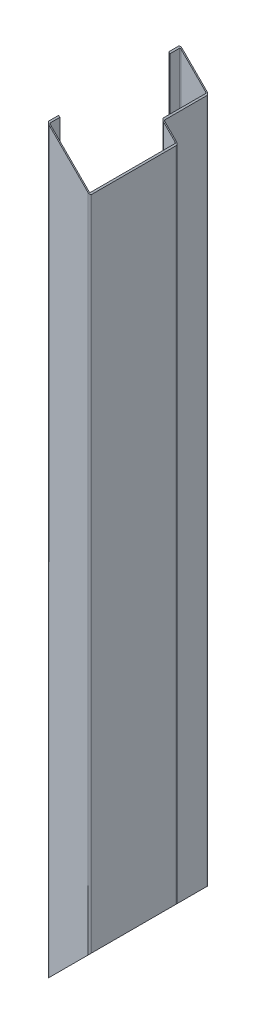
ISO-10303-21;
HEADER;
FILE_DESCRIPTION(('STEP AP214'),'2;1');
FILE_NAME('part.step','',(''),(''),'','','');
FILE_SCHEMA(('AUTOMOTIVE_DESIGN { 1 0 10303 214 1 1 1 1 }'));
ENDSEC;
DATA;
#1=APPLICATION_CONTEXT('core data for automotive mechanical design processes');
#2=APPLICATION_PROTOCOL_DEFINITION('international standard','automotive_design',2000,#1);
#3=PRODUCT_CONTEXT('',#1,'mechanical');
#4=PRODUCT('Part','Part','',(#3));
#5=PRODUCT_RELATED_PRODUCT_CATEGORY('part','',(#4));
#6=PRODUCT_DEFINITION_FORMATION('','',#4);
#7=PRODUCT_DEFINITION_CONTEXT('part definition',#1,'design');
#8=PRODUCT_DEFINITION('design','',#6,#7);
#9=PRODUCT_DEFINITION_SHAPE('','',#8);
#10=(LENGTH_UNIT() NAMED_UNIT(*) SI_UNIT(.MILLI.,.METRE.));
#11=(NAMED_UNIT(*) PLANE_ANGLE_UNIT() SI_UNIT($,.RADIAN.));
#12=(NAMED_UNIT(*) SI_UNIT($,.STERADIAN.) SOLID_ANGLE_UNIT());
#13=UNCERTAINTY_MEASURE_WITH_UNIT(LENGTH_MEASURE(1.E-05),#10,'distance_accuracy_value','');
#14=(GEOMETRIC_REPRESENTATION_CONTEXT(3) GLOBAL_UNCERTAINTY_ASSIGNED_CONTEXT((#13)) GLOBAL_UNIT_ASSIGNED_CONTEXT((#10,
#11,#12)) REPRESENTATION_CONTEXT('',''));
#15=CARTESIAN_POINT('',(0.,0.,0.));
#16=DIRECTION('',(0.,0.,1.));
#17=DIRECTION('',(1.,0.,0.));
#18=AXIS2_PLACEMENT_3D('',#15,#16,#17);
#19=CARTESIAN_POINT('',(10.75,390.5,70.));
#20=DIRECTION('',(-1.,0.,0.));
#21=DIRECTION('',(0.,0.,1.));
#22=AXIS2_PLACEMENT_3D('',#19,#20,#21);
#23=PLANE('',#22);
#24=DIRECTION('',(0.,-1.,0.));
#25=VECTOR('',#24,1.);
#26=CARTESIAN_POINT('',(10.75,390.5,58.));
#27=LINE('',#26,#25);
#28=CARTESIAN_POINT('',(10.75,389.25,58.));
#29=VERTEX_POINT('',#28);
#30=CARTESIAN_POINT('',(10.75,-389.25,58.));
#31=VERTEX_POINT('',#30);
#32=EDGE_CURVE('E11',#29,#31,#27,.T.);
#33=ORIENTED_EDGE('',*,*,#32,.F.);
#34=DIRECTION('',(0.,0.,1.));
#35=VECTOR('',#34,1.);
#36=CARTESIAN_POINT('',(10.75,389.25,70.));
#37=LINE('',#36,#35);
#38=CARTESIAN_POINT('',(10.75,389.25,68.0134));
#39=VERTEX_POINT('',#38);
#40=EDGE_CURVE('E459',#29,#39,#37,.T.);
#41=ORIENTED_EDGE('',*,*,#40,.T.);
#42=DIRECTION('',(0.,-1.,0.));
#43=VECTOR('',#42,1.);
#44=CARTESIAN_POINT('',(10.75,390.5,68.0134));
#45=LINE('',#44,#43);
#46=CARTESIAN_POINT('',(10.75,-389.25,68.0134));
#47=VERTEX_POINT('',#46);
#48=EDGE_CURVE('E301',#39,#47,#45,.T.);
#49=ORIENTED_EDGE('',*,*,#48,.T.);
#50=DIRECTION('',(0.,0.,-1.));
#51=VECTOR('',#50,1.);
#52=CARTESIAN_POINT('',(10.75,-389.25,69.9999999999991));
#53=LINE('',#52,#51);
#54=EDGE_CURVE('E266',#47,#31,#53,.T.);
#55=ORIENTED_EDGE('',*,*,#54,.T.);
#56=EDGE_LOOP('',(#33,#41,#49,#55));
#57=FACE_BOUND('',#56,.T.);
#58=ADVANCED_FACE('F39',(#57),#23,.F.);
#59=CARTESIAN_POINT('',(9.5,390.5,58.));
#60=DIRECTION('',(0.,0.,-1.));
#61=DIRECTION('',(-1.,0.,0.));
#62=AXIS2_PLACEMENT_3D('',#59,#60,#61);
#63=PLANE('',#62);
#64=DIRECTION('',(-0.707106781186544,0.707106781186551,0.));
#65=VECTOR('',#64,1.);
#66=CARTESIAN_POINT('',(9.49999999999995,390.5,58.));
#67=LINE('',#66,#65);
#68=CARTESIAN_POINT('',(9.49999999999991,390.5,58.));
#69=VERTEX_POINT('',#68);
#70=EDGE_CURVE('E258',#29,#69,#67,.T.);
#71=ORIENTED_EDGE('',*,*,#70,.F.);
#72=ORIENTED_EDGE('',*,*,#32,.T.);
#73=DIRECTION('',(0.707106781186543,0.707106781186552,0.));
#74=VECTOR('',#73,1.);
#75=CARTESIAN_POINT('',(400.,4.55191440096314E-12,58.));
#76=LINE('',#75,#74);
#77=CARTESIAN_POINT('',(9.5,-390.5,58.));
#78=VERTEX_POINT('',#77);
#79=EDGE_CURVE('E261',#78,#31,#76,.T.);
#80=ORIENTED_EDGE('',*,*,#79,.F.);
#81=DIRECTION('',(0.,-1.,0.));
#82=VECTOR('',#81,1.);
#83=CARTESIAN_POINT('',(9.5,390.5,58.));
#84=LINE('',#83,#82);
#85=EDGE_CURVE('E47',#69,#78,#84,.T.);
#86=ORIENTED_EDGE('',*,*,#85,.F.);
#87=EDGE_LOOP('',(#71,#72,#80,#86));
#88=FACE_BOUND('',#87,.T.);
#89=ADVANCED_FACE('F257',(#88),#63,.T.);
#90=CARTESIAN_POINT('',(9.49999999999999,390.5,70.));
#91=DIRECTION('',(-1.,0.,0.));
#92=DIRECTION('',(0.,0.,1.));
#93=AXIS2_PLACEMENT_3D('',#90,#91,#92);
#94=PLANE('',#93);
#95=DIRECTION('',(0.,0.,-1.));
#96=VECTOR('',#95,1.);
#97=CARTESIAN_POINT('',(9.49999999999999,-390.5,70.));
#98=LINE('',#97,#96);
#99=CARTESIAN_POINT('',(9.49999999999999,-390.5,68.0134));
#100=VERTEX_POINT('',#99);
#101=EDGE_CURVE('E253',#100,#78,#98,.T.);
#102=ORIENTED_EDGE('',*,*,#101,.F.);
#103=DIRECTION('',(0.,-1.,0.));
#104=VECTOR('',#103,1.);
#105=CARTESIAN_POINT('',(9.49999999999999,390.5,68.0134));
#106=LINE('',#105,#104);
#107=CARTESIAN_POINT('',(9.49999999999991,390.5,68.0134));
#108=VERTEX_POINT('',#107);
#109=EDGE_CURVE('E242',#108,#100,#106,.T.);
#110=ORIENTED_EDGE('',*,*,#109,.F.);
#111=DIRECTION('',(0.,0.,-1.));
#112=VECTOR('',#111,1.);
#113=CARTESIAN_POINT('',(9.49999999999999,390.5,70.));
#114=LINE('',#113,#112);
#115=EDGE_CURVE('E222',#108,#69,#114,.T.);
#116=ORIENTED_EDGE('',*,*,#115,.T.);
#117=ORIENTED_EDGE('',*,*,#85,.T.);
#118=EDGE_LOOP('',(#102,#110,#116,#117));
#119=FACE_BOUND('',#118,.T.);
#120=ADVANCED_FACE('F252',(#119),#94,.T.);
#121=CARTESIAN_POINT('',(11.4866,390.5,68.0134));
#122=DIRECTION('',(0.,-1.,0.));
#123=DIRECTION('',(0.,0.,-1.));
#124=AXIS2_PLACEMENT_3D('',#121,#122,#123);
#125=CYLINDRICAL_SURFACE('',#124,1.9866);
#126=CARTESIAN_POINT('',(11.4866,388.5134,68.0134));
#127=DIRECTION('',(-0.707106781186551,-0.707106781186544,0.));
#128=DIRECTION('',(0.707106781186544,-0.707106781186551,0.));
#129=AXIS2_PLACEMENT_3D('',#126,#127,#128);
#130=ELLIPSE('',#129,2.80947666301041,1.9866);
#131=CARTESIAN_POINT('',(11.4866,388.5134,70.));
#132=VERTEX_POINT('',#131);
#133=EDGE_CURVE('E216',#108,#132,#130,.F.);
#134=ORIENTED_EDGE('',*,*,#133,.F.);
#135=ORIENTED_EDGE('',*,*,#109,.T.);
#136=CARTESIAN_POINT('',(11.4866,-388.5134,68.0134));
#137=DIRECTION('',(-0.707106781186552,0.707106781186543,0.));
#138=DIRECTION('',(-0.707106781186543,-0.707106781186552,0.));
#139=AXIS2_PLACEMENT_3D('',#136,#137,#138);
#140=ELLIPSE('',#139,2.80947666301041,1.9866);
#141=CARTESIAN_POINT('',(11.4866,-388.5134,70.));
#142=VERTEX_POINT('',#141);
#143=EDGE_CURVE('E241',#142,#100,#140,.F.);
#144=ORIENTED_EDGE('',*,*,#143,.F.);
#145=DIRECTION('',(0.,-1.,0.));
#146=VECTOR('',#145,1.);
#147=CARTESIAN_POINT('',(11.4866,390.5,70.));
#148=LINE('',#147,#146);
#149=EDGE_CURVE('E234',#132,#142,#148,.T.);
#150=ORIENTED_EDGE('',*,*,#149,.F.);
#151=EDGE_LOOP('',(#134,#135,#144,#150));
#152=FACE_BOUND('',#151,.T.);
#153=ADVANCED_FACE('F240',(#152),#125,.T.);
#154=CARTESIAN_POINT('',(54.25,390.5,70.));
#155=DIRECTION('',(0.,0.,1.));
#156=DIRECTION('',(1.,0.,0.));
#157=AXIS2_PLACEMENT_3D('',#154,#155,#156);
#158=PLANE('',#157);
#159=DIRECTION('',(0.707106781186543,-0.707106781186551,0.));
#160=VECTOR('',#159,1.);
#161=CARTESIAN_POINT('',(9.49999999999991,390.5,70.));
#162=LINE('',#161,#160);
#163=CARTESIAN_POINT('',(52.2634,347.736599999999,70.));
#164=VERTEX_POINT('',#163);
#165=EDGE_CURVE('E219',#132,#164,#162,.T.);
#166=ORIENTED_EDGE('',*,*,#165,.F.);
#167=ORIENTED_EDGE('',*,*,#149,.T.);
#168=DIRECTION('',(-0.707106781186543,-0.707106781186552,0.));
#169=VECTOR('',#168,1.);
#170=CARTESIAN_POINT('',(9.5,-390.5,70.));
#171=LINE('',#170,#169);
#172=CARTESIAN_POINT('',(52.2634,-347.736599999999,70.));
#173=VERTEX_POINT('',#172);
#174=EDGE_CURVE('E227',#173,#142,#171,.T.);
#175=ORIENTED_EDGE('',*,*,#174,.F.);
#176=DIRECTION('',(0.,-1.,0.));
#177=VECTOR('',#176,1.);
#178=CARTESIAN_POINT('',(52.2634,390.5,70.));
#179=LINE('',#178,#177);
#180=EDGE_CURVE('E236',#164,#173,#179,.T.);
#181=ORIENTED_EDGE('',*,*,#180,.F.);
#182=EDGE_LOOP('',(#166,#167,#175,#181));
#183=FACE_BOUND('',#182,.T.);
#184=ADVANCED_FACE('F232',(#183),#158,.T.);
#185=CARTESIAN_POINT('',(52.2634,390.5,68.0134));
#186=DIRECTION('',(0.,-1.,0.));
#187=DIRECTION('',(0.,0.,-1.));
#188=AXIS2_PLACEMENT_3D('',#185,#186,#187);
#189=CYLINDRICAL_SURFACE('',#188,1.9866);
#190=CARTESIAN_POINT('',(52.2634,347.736599999999,68.0134));
#191=DIRECTION('',(-0.707106781186551,-0.707106781186544,0.));
#192=DIRECTION('',(0.707106781186544,-0.707106781186551,0.));
#193=AXIS2_PLACEMENT_3D('',#190,#191,#192);
#194=ELLIPSE('',#193,2.80947666301041,1.9866);
#195=CARTESIAN_POINT('',(54.2499999999996,345.75,68.0134));
#196=VERTEX_POINT('',#195);
#197=EDGE_CURVE('E228',#164,#196,#194,.F.);
#198=ORIENTED_EDGE('',*,*,#197,.F.);
#199=ORIENTED_EDGE('',*,*,#180,.T.);
#200=CARTESIAN_POINT('',(52.2634,-347.7366,68.0134));
#201=DIRECTION('',(-0.707106781186552,0.707106781186543,0.));
#202=DIRECTION('',(-0.707106781186543,-0.707106781186552,0.));
#203=AXIS2_PLACEMENT_3D('',#200,#201,#202);
#204=ELLIPSE('',#203,2.80947666301041,1.9866);
#205=CARTESIAN_POINT('',(54.2499999999996,-345.75,68.0134));
#206=VERTEX_POINT('',#205);
#207=EDGE_CURVE('E292',#206,#173,#204,.F.);
#208=ORIENTED_EDGE('',*,*,#207,.F.);
#209=DIRECTION('',(0.,-1.,0.));
#210=VECTOR('',#209,1.);
#211=CARTESIAN_POINT('',(54.25,390.5,68.0134));
#212=LINE('',#211,#210);
#213=EDGE_CURVE('E245',#196,#206,#212,.T.);
#214=ORIENTED_EDGE('',*,*,#213,.F.);
#215=EDGE_LOOP('',(#198,#199,#208,#214));
#216=FACE_BOUND('',#215,.T.);
#217=ADVANCED_FACE('F359',(#216),#189,.T.);
#218=CARTESIAN_POINT('',(54.25,390.5,-23.));
#219=DIRECTION('',(1.,0.,0.));
#220=DIRECTION('',(0.,0.,-1.));
#221=AXIS2_PLACEMENT_3D('',#218,#219,#220);
#222=PLANE('',#221);
#223=DIRECTION('',(0.,0.,-1.));
#224=VECTOR('',#223,1.);
#225=CARTESIAN_POINT('',(54.25,345.749999999999,-22.9999999999998));
#226=LINE('',#225,#224);
#227=CARTESIAN_POINT('',(54.25,345.749999999999,-21.0134));
#228=VERTEX_POINT('',#227);
#229=EDGE_CURVE('E354',#196,#228,#226,.T.);
#230=ORIENTED_EDGE('',*,*,#229,.F.);
#231=ORIENTED_EDGE('',*,*,#213,.T.);
#232=DIRECTION('',(0.,0.,1.));
#233=VECTOR('',#232,1.);
#234=CARTESIAN_POINT('',(54.25,-345.749999999999,-23.0000000000031));
#235=LINE('',#234,#233);
#236=CARTESIAN_POINT('',(54.25,-345.749999999999,-21.0134));
#237=VERTEX_POINT('',#236);
#238=EDGE_CURVE('E289',#237,#206,#235,.T.);
#239=ORIENTED_EDGE('',*,*,#238,.F.);
#240=DIRECTION('',(0.,-1.,0.));
#241=VECTOR('',#240,1.);
#242=CARTESIAN_POINT('',(54.25,390.5,-21.0134));
#243=LINE('',#242,#241);
#244=EDGE_CURVE('E347',#228,#237,#243,.T.);
#245=ORIENTED_EDGE('',*,*,#244,.F.);
#246=EDGE_LOOP('',(#230,#231,#239,#245));
#247=FACE_BOUND('',#246,.T.);
#248=ADVANCED_FACE('F352',(#247),#222,.T.);
#249=CARTESIAN_POINT('',(52.2634,390.5,-21.0134));
#250=DIRECTION('',(0.,-1.,0.));
#251=DIRECTION('',(0.,0.,-1.));
#252=AXIS2_PLACEMENT_3D('',#249,#250,#251);
#253=CYLINDRICAL_SURFACE('',#252,1.9866);
#254=CARTESIAN_POINT('',(52.2634,347.736599999999,-21.0134));
#255=DIRECTION('',(-0.707106781186551,-0.707106781186544,0.));
#256=DIRECTION('',(0.707106781186544,-0.707106781186551,0.));
#257=AXIS2_PLACEMENT_3D('',#254,#255,#256);
#258=ELLIPSE('',#257,2.80947666301041,1.9866);
#259=CARTESIAN_POINT('',(52.2634,347.736599999999,-23.));
#260=VERTEX_POINT('',#259);
#261=EDGE_CURVE('E361',#228,#260,#258,.F.);
#262=ORIENTED_EDGE('',*,*,#261,.F.);
#263=ORIENTED_EDGE('',*,*,#244,.T.);
#264=CARTESIAN_POINT('',(52.2634,-347.7366,-21.0134));
#265=DIRECTION('',(-0.707106781186552,0.707106781186543,0.));
#266=DIRECTION('',(-0.707106781186543,-0.707106781186552,0.));
#267=AXIS2_PLACEMENT_3D('',#264,#265,#266);
#268=ELLIPSE('',#267,2.80947666301041,1.9866);
#269=CARTESIAN_POINT('',(52.2634,-347.7366,-23.));
#270=VERTEX_POINT('',#269);
#271=EDGE_CURVE('E286',#270,#237,#268,.F.);
#272=ORIENTED_EDGE('',*,*,#271,.F.);
#273=DIRECTION('',(0.,-1.,0.));
#274=VECTOR('',#273,1.);
#275=CARTESIAN_POINT('',(52.2634,390.5,-23.));
#276=LINE('',#275,#274);
#277=EDGE_CURVE('E345',#260,#270,#276,.T.);
#278=ORIENTED_EDGE('',*,*,#277,.F.);
#279=EDGE_LOOP('',(#262,#263,#272,#278));
#280=FACE_BOUND('',#279,.T.);
#281=ADVANCED_FACE('F451',(#280),#253,.T.);
#282=CARTESIAN_POINT('',(39.5,390.5,-23.));
#283=DIRECTION('',(0.,0.,-1.));
#284=DIRECTION('',(-1.,0.,0.));
#285=AXIS2_PLACEMENT_3D('',#282,#283,#284);
#286=PLANE('',#285);
#287=DIRECTION('',(-0.707106781186544,0.707106781186551,0.));
#288=VECTOR('',#287,1.);
#289=CARTESIAN_POINT('',(24.4999999999998,375.5,-23.));
#290=LINE('',#289,#288);
#291=CARTESIAN_POINT('',(40.2366,359.7634,-23.));
#292=VERTEX_POINT('',#291);
#293=EDGE_CURVE('E448',#260,#292,#290,.T.);
#294=ORIENTED_EDGE('',*,*,#293,.F.);
#295=ORIENTED_EDGE('',*,*,#277,.T.);
#296=DIRECTION('',(0.707106781186543,0.707106781186552,0.));
#297=VECTOR('',#296,1.);
#298=CARTESIAN_POINT('',(415.,15.0000000000046,-23.));
#299=LINE('',#298,#297);
#300=CARTESIAN_POINT('',(40.2366,-359.7634,-23.));
#301=VERTEX_POINT('',#300);
#302=EDGE_CURVE('E283',#301,#270,#299,.T.);
#303=ORIENTED_EDGE('',*,*,#302,.F.);
#304=DIRECTION('',(0.,-1.,0.));
#305=VECTOR('',#304,1.);
#306=CARTESIAN_POINT('',(40.2366,390.5,-23.));
#307=LINE('',#306,#305);
#308=EDGE_CURVE('E343',#292,#301,#307,.T.);
#309=ORIENTED_EDGE('',*,*,#308,.F.);
#310=EDGE_LOOP('',(#294,#295,#303,#309));
#311=FACE_BOUND('',#310,.T.);
#312=ADVANCED_FACE('F446',(#311),#286,.T.);
#313=CARTESIAN_POINT('',(40.2366,390.5,-23.7366));
#314=DIRECTION('',(0.,-1.,0.));
#315=DIRECTION('',(0.,0.,-1.));
#316=AXIS2_PLACEMENT_3D('',#313,#314,#315);
#317=CYLINDRICAL_SURFACE('',#316,0.7366);
#318=CARTESIAN_POINT('',(40.2366,359.7634,-23.7366));
#319=DIRECTION('',(-0.707106781186551,-0.707106781186544,0.));
#320=DIRECTION('',(0.707106781186544,-0.707106781186551,0.));
#321=AXIS2_PLACEMENT_3D('',#318,#319,#320);
#322=ELLIPSE('',#321,1.04170971004403,0.7366);
#323=CARTESIAN_POINT('',(39.5,360.5,-23.7366));
#324=VERTEX_POINT('',#323);
#325=EDGE_CURVE('E441',#292,#324,#322,.T.);
#326=ORIENTED_EDGE('',*,*,#325,.F.);
#327=ORIENTED_EDGE('',*,*,#308,.T.);
#328=CARTESIAN_POINT('',(40.2366,-359.7634,-23.7366));
#329=DIRECTION('',(-0.707106781186552,0.707106781186543,0.));
#330=DIRECTION('',(-0.707106781186543,-0.707106781186552,0.));
#331=AXIS2_PLACEMENT_3D('',#328,#329,#330);
#332=ELLIPSE('',#331,1.04170971004403,0.7366);
#333=CARTESIAN_POINT('',(39.5,-360.5,-23.7366));
#334=VERTEX_POINT('',#333);
#335=EDGE_CURVE('E280',#334,#301,#332,.T.);
#336=ORIENTED_EDGE('',*,*,#335,.F.);
#337=DIRECTION('',(0.,-1.,0.));
#338=VECTOR('',#337,1.);
#339=CARTESIAN_POINT('',(39.5,390.5,-23.7366));
#340=LINE('',#339,#338);
#341=EDGE_CURVE('E341',#324,#334,#340,.T.);
#342=ORIENTED_EDGE('',*,*,#341,.F.);
#343=EDGE_LOOP('',(#326,#327,#336,#342));
#344=FACE_BOUND('',#343,.T.);
#345=ADVANCED_FACE('F440',(#344),#317,.F.);
#346=CARTESIAN_POINT('',(39.5,390.5,-70.));
#347=DIRECTION('',(1.,0.,0.));
#348=DIRECTION('',(0.,0.,-1.));
#349=AXIS2_PLACEMENT_3D('',#346,#347,#348);
#350=PLANE('',#349);
#351=DIRECTION('',(0.,0.,-1.));
#352=VECTOR('',#351,1.);
#353=CARTESIAN_POINT('',(39.5,360.5,-70.));
#354=LINE('',#353,#352);
#355=CARTESIAN_POINT('',(39.5,360.5,-68.0134));
#356=VERTEX_POINT('',#355);
#357=EDGE_CURVE('E437',#324,#356,#354,.T.);
#358=ORIENTED_EDGE('',*,*,#357,.F.);
#359=ORIENTED_EDGE('',*,*,#341,.T.);
#360=DIRECTION('',(0.,0.,1.));
#361=VECTOR('',#360,1.);
#362=CARTESIAN_POINT('',(39.5,-360.5,-70.));
#363=LINE('',#362,#361);
#364=CARTESIAN_POINT('',(39.5,-360.5,-68.0134));
#365=VERTEX_POINT('',#364);
#366=EDGE_CURVE('E277',#365,#334,#363,.T.);
#367=ORIENTED_EDGE('',*,*,#366,.F.);
#368=DIRECTION('',(0.,-1.,0.));
#369=VECTOR('',#368,1.);
#370=CARTESIAN_POINT('',(39.5,390.5,-68.0134));
#371=LINE('',#370,#369);
#372=EDGE_CURVE('E339',#356,#365,#371,.T.);
#373=ORIENTED_EDGE('',*,*,#372,.F.);
#374=EDGE_LOOP('',(#358,#359,#367,#373));
#375=FACE_BOUND('',#374,.T.);
#376=ADVANCED_FACE('F435',(#375),#350,.T.);
#377=CARTESIAN_POINT('',(37.5134,390.5,-68.0134));
#378=DIRECTION('',(0.,-1.,0.));
#379=DIRECTION('',(0.,0.,-1.));
#380=AXIS2_PLACEMENT_3D('',#377,#378,#379);
#381=CYLINDRICAL_SURFACE('',#380,1.9866);
#382=CARTESIAN_POINT('',(37.5134,362.4866,-68.0134));
#383=DIRECTION('',(-0.707106781186551,-0.707106781186544,0.));
#384=DIRECTION('',(0.707106781186544,-0.707106781186551,0.));
#385=AXIS2_PLACEMENT_3D('',#382,#383,#384);
#386=ELLIPSE('',#385,2.80947666301041,1.9866);
#387=CARTESIAN_POINT('',(37.5134,362.4866,-70.));
#388=VERTEX_POINT('',#387);
#389=EDGE_CURVE('E429',#356,#388,#386,.F.);
#390=ORIENTED_EDGE('',*,*,#389,.F.);
#391=ORIENTED_EDGE('',*,*,#372,.T.);
#392=CARTESIAN_POINT('',(37.5134,-362.4866,-68.0134));
#393=DIRECTION('',(-0.707106781186552,0.707106781186543,0.));
#394=DIRECTION('',(-0.707106781186543,-0.707106781186552,0.));
#395=AXIS2_PLACEMENT_3D('',#392,#393,#394);
#396=ELLIPSE('',#395,2.80947666301041,1.9866);
#397=CARTESIAN_POINT('',(37.5133999999999,-362.4866,-70.));
#398=VERTEX_POINT('',#397);
#399=EDGE_CURVE('E269',#398,#365,#396,.F.);
#400=ORIENTED_EDGE('',*,*,#399,.F.);
#401=DIRECTION('',(0.,-1.,0.));
#402=VECTOR('',#401,1.);
#403=CARTESIAN_POINT('',(37.5134,390.5,-70.));
#404=LINE('',#403,#402);
#405=EDGE_CURVE('E337',#388,#398,#404,.T.);
#406=ORIENTED_EDGE('',*,*,#405,.F.);
#407=EDGE_LOOP('',(#390,#391,#400,#406));
#408=FACE_BOUND('',#407,.T.);
#409=ADVANCED_FACE('F428',(#408),#381,.T.);
#410=CARTESIAN_POINT('',(9.49999999999999,390.5,-70.));
#411=DIRECTION('',(0.,0.,-1.));
#412=DIRECTION('',(-1.,0.,0.));
#413=AXIS2_PLACEMENT_3D('',#410,#411,#412);
#414=PLANE('',#413);
#415=DIRECTION('',(0.707106781186543,-0.707106781186551,0.));
#416=VECTOR('',#415,1.);
#417=CARTESIAN_POINT('',(9.49999999999991,390.5,-70.));
#418=LINE('',#417,#416);
#419=CARTESIAN_POINT('',(11.4866,388.5134,-70.));
#420=VERTEX_POINT('',#419);
#421=EDGE_CURVE('E237',#420,#388,#418,.T.);
#422=ORIENTED_EDGE('',*,*,#421,.T.);
#423=ORIENTED_EDGE('',*,*,#405,.T.);
#424=DIRECTION('',(-0.707106781186543,-0.707106781186552,0.));
#425=VECTOR('',#424,1.);
#426=CARTESIAN_POINT('',(9.5,-390.5,-70.));
#427=LINE('',#426,#425);
#428=CARTESIAN_POINT('',(11.4866,-388.5134,-70.));
#429=VERTEX_POINT('',#428);
#430=EDGE_CURVE('E365',#398,#429,#427,.T.);
#431=ORIENTED_EDGE('',*,*,#430,.T.);
#432=DIRECTION('',(0.,-1.,0.));
#433=VECTOR('',#432,1.);
#434=CARTESIAN_POINT('',(11.4866,390.5,-70.));
#435=LINE('',#434,#433);
#436=EDGE_CURVE('E335',#420,#429,#435,.T.);
#437=ORIENTED_EDGE('',*,*,#436,.F.);
#438=EDGE_LOOP('',(#422,#423,#431,#437));
#439=FACE_BOUND('',#438,.T.);
#440=ADVANCED_FACE('F424',(#439),#414,.T.);
#441=CARTESIAN_POINT('',(11.4866,390.5,-68.0134));
#442=DIRECTION('',(0.,-1.,0.));
#443=DIRECTION('',(0.,0.,-1.));
#444=AXIS2_PLACEMENT_3D('',#441,#442,#443);
#445=CYLINDRICAL_SURFACE('',#444,1.9866);
#446=CARTESIAN_POINT('',(11.4866,388.5134,-68.0134));
#447=DIRECTION('',(-0.707106781186551,-0.707106781186544,0.));
#448=DIRECTION('',(0.707106781186544,-0.707106781186551,0.));
#449=AXIS2_PLACEMENT_3D('',#446,#447,#448);
#450=ELLIPSE('',#449,2.80947666301041,1.9866);
#451=CARTESIAN_POINT('',(9.49999999999999,390.5,-68.0134));
#452=VERTEX_POINT('',#451);
#453=EDGE_CURVE('E53',#420,#452,#450,.F.);
#454=ORIENTED_EDGE('',*,*,#453,.F.);
#455=ORIENTED_EDGE('',*,*,#436,.T.);
#456=CARTESIAN_POINT('',(11.4866,-388.5134,-68.0134));
#457=DIRECTION('',(-0.707106781186552,0.707106781186543,0.));
#458=DIRECTION('',(-0.707106781186543,-0.707106781186552,0.));
#459=AXIS2_PLACEMENT_3D('',#456,#457,#458);
#460=ELLIPSE('',#459,2.80947666301041,1.9866);
#461=CARTESIAN_POINT('',(9.5,-390.5,-68.0134));
#462=VERTEX_POINT('',#461);
#463=EDGE_CURVE('E265',#462,#429,#460,.F.);
#464=ORIENTED_EDGE('',*,*,#463,.F.);
#465=DIRECTION('',(0.,-1.,0.));
#466=VECTOR('',#465,1.);
#467=CARTESIAN_POINT('',(9.49999999999999,390.5,-68.0134));
#468=LINE('',#467,#466);
#469=EDGE_CURVE('E332',#452,#462,#468,.T.);
#470=ORIENTED_EDGE('',*,*,#469,.F.);
#471=EDGE_LOOP('',(#454,#455,#464,#470));
#472=FACE_BOUND('',#471,.T.);
#473=ADVANCED_FACE('F418',(#472),#445,.T.);
#474=CARTESIAN_POINT('',(9.49999999999999,390.5,-70.));
#475=DIRECTION('',(-1.,0.,0.));
#476=DIRECTION('',(0.,0.,1.));
#477=AXIS2_PLACEMENT_3D('',#474,#475,#476);
#478=PLANE('',#477);
#479=DIRECTION('',(0.,0.,-1.));
#480=VECTOR('',#479,1.);
#481=CARTESIAN_POINT('',(9.49999999999999,-390.5,-70.));
#482=LINE('',#481,#480);
#483=CARTESIAN_POINT('',(9.5,-390.5,-58.));
#484=VERTEX_POINT('',#483);
#485=EDGE_CURVE('E298',#484,#462,#482,.T.);
#486=ORIENTED_EDGE('',*,*,#485,.F.);
#487=DIRECTION('',(0.,-1.,0.));
#488=VECTOR('',#487,1.);
#489=CARTESIAN_POINT('',(9.49999999999999,390.5,-58.));
#490=LINE('',#489,#488);
#491=CARTESIAN_POINT('',(9.49999999999991,390.5,-58.));
#492=VERTEX_POINT('',#491);
#493=EDGE_CURVE('E329',#492,#484,#490,.T.);
#494=ORIENTED_EDGE('',*,*,#493,.F.);
#495=DIRECTION('',(0.,0.,-1.));
#496=VECTOR('',#495,1.);
#497=CARTESIAN_POINT('',(9.49999999999999,390.5,-70.));
#498=LINE('',#497,#496);
#499=EDGE_CURVE('E297',#492,#452,#498,.T.);
#500=ORIENTED_EDGE('',*,*,#499,.T.);
#501=ORIENTED_EDGE('',*,*,#469,.T.);
#502=EDGE_LOOP('',(#486,#494,#500,#501));
#503=FACE_BOUND('',#502,.T.);
#504=ADVANCED_FACE('F416',(#503),#478,.T.);
#505=CARTESIAN_POINT('',(10.75,390.5,-58.));
#506=DIRECTION('',(0.,0.,1.));
#507=DIRECTION('',(1.,0.,0.));
#508=AXIS2_PLACEMENT_3D('',#505,#506,#507);
#509=PLANE('',#508);
#510=DIRECTION('',(0.707106781186544,-0.707106781186551,0.));
#511=VECTOR('',#510,1.);
#512=CARTESIAN_POINT('',(10.1249999999999,389.875,-58.));
#513=LINE('',#512,#511);
#514=CARTESIAN_POINT('',(10.75,389.25,-58.));
#515=VERTEX_POINT('',#514);
#516=EDGE_CURVE('E414',#492,#515,#513,.T.);
#517=ORIENTED_EDGE('',*,*,#516,.F.);
#518=ORIENTED_EDGE('',*,*,#493,.T.);
#519=DIRECTION('',(-0.707106781186543,-0.707106781186552,0.));
#520=VECTOR('',#519,1.);
#521=CARTESIAN_POINT('',(400.625,0.625000000004539,-58.));
#522=LINE('',#521,#520);
#523=CARTESIAN_POINT('',(10.75,-389.25,-58.));
#524=VERTEX_POINT('',#523);
#525=EDGE_CURVE('E271',#524,#484,#522,.T.);
#526=ORIENTED_EDGE('',*,*,#525,.F.);
#527=DIRECTION('',(0.,-1.,0.));
#528=VECTOR('',#527,1.);
#529=CARTESIAN_POINT('',(10.75,390.5,-58.));
#530=LINE('',#529,#528);
#531=EDGE_CURVE('E327',#515,#524,#530,.T.);
#532=ORIENTED_EDGE('',*,*,#531,.F.);
#533=EDGE_LOOP('',(#517,#518,#526,#532));
#534=FACE_BOUND('',#533,.T.);
#535=ADVANCED_FACE('F413',(#534),#509,.T.);
#536=CARTESIAN_POINT('',(10.75,390.5,-70.));
#537=DIRECTION('',(-1.,0.,0.));
#538=DIRECTION('',(0.,0.,1.));
#539=AXIS2_PLACEMENT_3D('',#536,#537,#538);
#540=PLANE('',#539);
#541=DIRECTION('',(0.,-1.,0.));
#542=VECTOR('',#541,1.);
#543=CARTESIAN_POINT('',(10.75,390.5,-68.0134));
#544=LINE('',#543,#542);
#545=CARTESIAN_POINT('',(10.75,389.25,-68.0134));
#546=VERTEX_POINT('',#545);
#547=CARTESIAN_POINT('',(10.75,-389.25,-68.0134));
#548=VERTEX_POINT('',#547);
#549=EDGE_CURVE('E325',#546,#548,#544,.T.);
#550=ORIENTED_EDGE('',*,*,#549,.F.);
#551=DIRECTION('',(0.,0.,1.));
#552=VECTOR('',#551,1.);
#553=CARTESIAN_POINT('',(10.75,389.25,-70.));
#554=LINE('',#553,#552);
#555=EDGE_CURVE('E463',#546,#515,#554,.T.);
#556=ORIENTED_EDGE('',*,*,#555,.T.);
#557=ORIENTED_EDGE('',*,*,#531,.T.);
#558=DIRECTION('',(0.,0.,-1.));
#559=VECTOR('',#558,1.);
#560=CARTESIAN_POINT('',(10.75,-389.25,-69.9999999999999));
#561=LINE('',#560,#559);
#562=EDGE_CURVE('E402',#524,#548,#561,.T.);
#563=ORIENTED_EDGE('',*,*,#562,.T.);
#564=EDGE_LOOP('',(#550,#556,#557,#563));
#565=FACE_BOUND('',#564,.T.);
#566=ADVANCED_FACE('F544',(#565),#540,.F.);
#567=CARTESIAN_POINT('',(11.4866,390.5,-68.0134));
#568=DIRECTION('',(0.,-1.,0.));
#569=DIRECTION('',(0.,0.,-1.));
#570=AXIS2_PLACEMENT_3D('',#567,#568,#569);
#571=CYLINDRICAL_SURFACE('',#570,0.7366);
#572=DIRECTION('',(0.,-1.,0.));
#573=VECTOR('',#572,1.);
#574=CARTESIAN_POINT('',(11.4866,390.5,-68.75));
#575=LINE('',#574,#573);
#576=CARTESIAN_POINT('',(11.4866,388.5134,-68.75));
#577=VERTEX_POINT('',#576);
#578=CARTESIAN_POINT('',(11.4866,-388.5134,-68.75));
#579=VERTEX_POINT('',#578);
#580=EDGE_CURVE('E323',#577,#579,#575,.T.);
#581=ORIENTED_EDGE('',*,*,#580,.F.);
#582=CARTESIAN_POINT('',(11.4866,388.5134,-68.0134));
#583=DIRECTION('',(-0.707106781186551,-0.707106781186544,0.));
#584=DIRECTION('',(0.707106781186544,-0.707106781186551,0.));
#585=AXIS2_PLACEMENT_3D('',#582,#583,#584);
#586=ELLIPSE('',#585,1.04170971004403,0.7366);
#587=EDGE_CURVE('E466',#577,#546,#586,.F.);
#588=ORIENTED_EDGE('',*,*,#587,.T.);
#589=ORIENTED_EDGE('',*,*,#549,.T.);
#590=CARTESIAN_POINT('',(11.4866,-388.5134,-68.0134));
#591=DIRECTION('',(-0.707106781186552,0.707106781186543,0.));
#592=DIRECTION('',(-0.707106781186543,-0.707106781186552,0.));
#593=AXIS2_PLACEMENT_3D('',#590,#591,#592);
#594=ELLIPSE('',#593,1.04170971004403,0.7366);
#595=EDGE_CURVE('E399',#548,#579,#594,.F.);
#596=ORIENTED_EDGE('',*,*,#595,.T.);
#597=EDGE_LOOP('',(#581,#588,#589,#596));
#598=FACE_BOUND('',#597,.T.);
#599=ADVANCED_FACE('F541',(#598),#571,.F.);
#600=CARTESIAN_POINT('',(9.49999999999999,390.5,-68.75));
#601=DIRECTION('',(0.,0.,-1.));
#602=DIRECTION('',(-1.,0.,0.));
#603=AXIS2_PLACEMENT_3D('',#600,#601,#602);
#604=PLANE('',#603);
#605=DIRECTION('',(0.,-1.,0.));
#606=VECTOR('',#605,1.);
#607=CARTESIAN_POINT('',(37.5134,390.5,-68.75));
#608=LINE('',#607,#606);
#609=CARTESIAN_POINT('',(37.5134,362.4866,-68.75));
#610=VERTEX_POINT('',#609);
#611=CARTESIAN_POINT('',(37.5134,-362.4866,-68.75));
#612=VERTEX_POINT('',#611);
#613=EDGE_CURVE('E321',#610,#612,#608,.T.);
#614=ORIENTED_EDGE('',*,*,#613,.F.);
#615=DIRECTION('',(-0.707106781186544,0.707106781186551,0.));
#616=VECTOR('',#615,1.);
#617=CARTESIAN_POINT('',(9.49999999999995,390.5,-68.75));
#618=LINE('',#617,#616);
#619=EDGE_CURVE('E469',#610,#577,#618,.T.);
#620=ORIENTED_EDGE('',*,*,#619,.T.);
#621=ORIENTED_EDGE('',*,*,#580,.T.);
#622=DIRECTION('',(0.707106781186543,0.707106781186552,0.));
#623=VECTOR('',#622,1.);
#624=CARTESIAN_POINT('',(400.,4.55191440096314E-12,-68.7499999999998));
#625=LINE('',#624,#623);
#626=EDGE_CURVE('E396',#579,#612,#625,.T.);
#627=ORIENTED_EDGE('',*,*,#626,.T.);
#628=EDGE_LOOP('',(#614,#620,#621,#627));
#629=FACE_BOUND('',#628,.T.);
#630=ADVANCED_FACE('F538',(#629),#604,.F.);
#631=CARTESIAN_POINT('',(37.5134,390.5,-68.0134));
#632=DIRECTION('',(0.,-1.,0.));
#633=DIRECTION('',(0.,0.,-1.));
#634=AXIS2_PLACEMENT_3D('',#631,#632,#633);
#635=CYLINDRICAL_SURFACE('',#634,0.7366);
#636=DIRECTION('',(0.,-1.,0.));
#637=VECTOR('',#636,1.);
#638=CARTESIAN_POINT('',(38.25,390.5,-68.0134));
#639=LINE('',#638,#637);
#640=CARTESIAN_POINT('',(38.25,361.75,-68.0134));
#641=VERTEX_POINT('',#640);
#642=CARTESIAN_POINT('',(38.25,-361.75,-68.0134));
#643=VERTEX_POINT('',#642);
#644=EDGE_CURVE('E319',#641,#643,#639,.T.);
#645=ORIENTED_EDGE('',*,*,#644,.F.);
#646=CARTESIAN_POINT('',(37.5134,362.4866,-68.0134));
#647=DIRECTION('',(-0.707106781186551,-0.707106781186544,0.));
#648=DIRECTION('',(0.707106781186544,-0.707106781186551,0.));
#649=AXIS2_PLACEMENT_3D('',#646,#647,#648);
#650=ELLIPSE('',#649,1.04170971004403,0.7366);
#651=EDGE_CURVE('E472',#641,#610,#650,.F.);
#652=ORIENTED_EDGE('',*,*,#651,.T.);
#653=ORIENTED_EDGE('',*,*,#613,.T.);
#654=CARTESIAN_POINT('',(37.5134,-362.4866,-68.0134));
#655=DIRECTION('',(-0.707106781186552,0.707106781186543,0.));
#656=DIRECTION('',(-0.707106781186543,-0.707106781186552,0.));
#657=AXIS2_PLACEMENT_3D('',#654,#655,#656);
#658=ELLIPSE('',#657,1.04170971004403,0.7366);
#659=EDGE_CURVE('E393',#612,#643,#658,.F.);
#660=ORIENTED_EDGE('',*,*,#659,.T.);
#661=EDGE_LOOP('',(#645,#652,#653,#660));
#662=FACE_BOUND('',#661,.T.);
#663=ADVANCED_FACE('F535',(#662),#635,.F.);
#664=CARTESIAN_POINT('',(38.25,390.5,-70.));
#665=DIRECTION('',(1.,0.,0.));
#666=DIRECTION('',(0.,0.,-1.));
#667=AXIS2_PLACEMENT_3D('',#664,#665,#666);
#668=PLANE('',#667);
#669=DIRECTION('',(0.,-1.,0.));
#670=VECTOR('',#669,1.);
#671=CARTESIAN_POINT('',(38.25,390.5,-23.7366));
#672=LINE('',#671,#670);
#673=CARTESIAN_POINT('',(38.25,361.75,-23.7366));
#674=VERTEX_POINT('',#673);
#675=CARTESIAN_POINT('',(38.25,-361.75,-23.7366));
#676=VERTEX_POINT('',#675);
#677=EDGE_CURVE('E317',#674,#676,#672,.T.);
#678=ORIENTED_EDGE('',*,*,#677,.F.);
#679=DIRECTION('',(0.,0.,-1.));
#680=VECTOR('',#679,1.);
#681=CARTESIAN_POINT('',(38.25,361.75,-70.));
#682=LINE('',#681,#680);
#683=EDGE_CURVE('E475',#674,#641,#682,.T.);
#684=ORIENTED_EDGE('',*,*,#683,.T.);
#685=ORIENTED_EDGE('',*,*,#644,.T.);
#686=DIRECTION('',(0.,0.,1.));
#687=VECTOR('',#686,1.);
#688=CARTESIAN_POINT('',(38.25,-361.75,-70.));
#689=LINE('',#688,#687);
#690=EDGE_CURVE('E390',#643,#676,#689,.T.);
#691=ORIENTED_EDGE('',*,*,#690,.T.);
#692=EDGE_LOOP('',(#678,#684,#685,#691));
#693=FACE_BOUND('',#692,.T.);
#694=ADVANCED_FACE('F530',(#693),#668,.F.);
#695=CARTESIAN_POINT('',(40.2366,390.5,-23.7366));
#696=DIRECTION('',(0.,-1.,0.));
#697=DIRECTION('',(0.,0.,-1.));
#698=AXIS2_PLACEMENT_3D('',#695,#696,#697);
#699=CYLINDRICAL_SURFACE('',#698,1.9866);
#700=DIRECTION('',(0.,-1.,0.));
#701=VECTOR('',#700,1.);
#702=CARTESIAN_POINT('',(40.2366,390.5,-21.75));
#703=LINE('',#702,#701);
#704=CARTESIAN_POINT('',(40.2366,359.7634,-21.75));
#705=VERTEX_POINT('',#704);
#706=CARTESIAN_POINT('',(40.2366,-359.7634,-21.75));
#707=VERTEX_POINT('',#706);
#708=EDGE_CURVE('E315',#705,#707,#703,.T.);
#709=ORIENTED_EDGE('',*,*,#708,.F.);
#710=CARTESIAN_POINT('',(40.2366,359.7634,-23.7366));
#711=DIRECTION('',(-0.707106781186551,-0.707106781186544,0.));
#712=DIRECTION('',(0.707106781186544,-0.707106781186551,0.));
#713=AXIS2_PLACEMENT_3D('',#710,#711,#712);
#714=ELLIPSE('',#713,2.80947666301041,1.9866);
#715=EDGE_CURVE('E478',#705,#674,#714,.T.);
#716=ORIENTED_EDGE('',*,*,#715,.T.);
#717=ORIENTED_EDGE('',*,*,#677,.T.);
#718=CARTESIAN_POINT('',(40.2366,-359.7634,-23.7366));
#719=DIRECTION('',(-0.707106781186552,0.707106781186543,0.));
#720=DIRECTION('',(-0.707106781186543,-0.707106781186552,0.));
#721=AXIS2_PLACEMENT_3D('',#718,#719,#720);
#722=ELLIPSE('',#721,2.80947666301041,1.9866);
#723=EDGE_CURVE('E387',#676,#707,#722,.T.);
#724=ORIENTED_EDGE('',*,*,#723,.T.);
#725=EDGE_LOOP('',(#709,#716,#717,#724));
#726=FACE_BOUND('',#725,.T.);
#727=ADVANCED_FACE('F527',(#726),#699,.T.);
#728=CARTESIAN_POINT('',(39.5,390.5,-21.75));
#729=DIRECTION('',(0.,0.,-1.));
#730=DIRECTION('',(-1.,0.,0.));
#731=AXIS2_PLACEMENT_3D('',#728,#729,#730);
#732=PLANE('',#731);
#733=DIRECTION('',(0.,-1.,0.));
#734=VECTOR('',#733,1.);
#735=CARTESIAN_POINT('',(52.2634,390.5,-21.75));
#736=LINE('',#735,#734);
#737=CARTESIAN_POINT('',(52.2634,347.736599999999,-21.75));
#738=VERTEX_POINT('',#737);
#739=CARTESIAN_POINT('',(52.2634,-347.7366,-21.75));
#740=VERTEX_POINT('',#739);
#741=EDGE_CURVE('E313',#738,#740,#736,.T.);
#742=ORIENTED_EDGE('',*,*,#741,.F.);
#743=DIRECTION('',(-0.707106781186544,0.707106781186551,0.));
#744=VECTOR('',#743,1.);
#745=CARTESIAN_POINT('',(24.4999999999998,375.5,-21.75));
#746=LINE('',#745,#744);
#747=EDGE_CURVE('E481',#738,#705,#746,.T.);
#748=ORIENTED_EDGE('',*,*,#747,.T.);
#749=ORIENTED_EDGE('',*,*,#708,.T.);
#750=DIRECTION('',(0.707106781186543,0.707106781186552,0.));
#751=VECTOR('',#750,1.);
#752=CARTESIAN_POINT('',(415.,15.0000000000046,-21.75));
#753=LINE('',#752,#751);
#754=EDGE_CURVE('E384',#707,#740,#753,.T.);
#755=ORIENTED_EDGE('',*,*,#754,.T.);
#756=EDGE_LOOP('',(#742,#748,#749,#755));
#757=FACE_BOUND('',#756,.T.);
#758=ADVANCED_FACE('F522',(#757),#732,.F.);
#759=CARTESIAN_POINT('',(52.2634,390.5,-21.0134));
#760=DIRECTION('',(0.,-1.,0.));
#761=DIRECTION('',(0.,0.,-1.));
#762=AXIS2_PLACEMENT_3D('',#759,#760,#761);
#763=CYLINDRICAL_SURFACE('',#762,0.7366);
#764=DIRECTION('',(0.,-1.,0.));
#765=VECTOR('',#764,1.);
#766=CARTESIAN_POINT('',(53.,390.5,-21.0134));
#767=LINE('',#766,#765);
#768=CARTESIAN_POINT('',(53.,346.999999999999,-21.0134));
#769=VERTEX_POINT('',#768);
#770=CARTESIAN_POINT('',(53.,-346.999999999999,-21.0134));
#771=VERTEX_POINT('',#770);
#772=EDGE_CURVE('E311',#769,#771,#767,.T.);
#773=ORIENTED_EDGE('',*,*,#772,.F.);
#774=CARTESIAN_POINT('',(52.2634,347.736599999999,-21.0134));
#775=DIRECTION('',(-0.707106781186551,-0.707106781186544,0.));
#776=DIRECTION('',(0.707106781186544,-0.707106781186551,0.));
#777=AXIS2_PLACEMENT_3D('',#774,#775,#776);
#778=ELLIPSE('',#777,1.04170971004403,0.7366);
#779=EDGE_CURVE('E484',#769,#738,#778,.F.);
#780=ORIENTED_EDGE('',*,*,#779,.T.);
#781=ORIENTED_EDGE('',*,*,#741,.T.);
#782=CARTESIAN_POINT('',(52.2634,-347.7366,-21.0134));
#783=DIRECTION('',(-0.707106781186552,0.707106781186543,0.));
#784=DIRECTION('',(-0.707106781186543,-0.707106781186552,0.));
#785=AXIS2_PLACEMENT_3D('',#782,#783,#784);
#786=ELLIPSE('',#785,1.04170971004403,0.7366);
#787=EDGE_CURVE('E381',#740,#771,#786,.F.);
#788=ORIENTED_EDGE('',*,*,#787,.T.);
#789=EDGE_LOOP('',(#773,#780,#781,#788));
#790=FACE_BOUND('',#789,.T.);
#791=ADVANCED_FACE('F519',(#790),#763,.F.);
#792=CARTESIAN_POINT('',(53.,390.5,23.));
#793=DIRECTION('',(1.,0.,0.));
#794=DIRECTION('',(0.,0.,-1.));
#795=AXIS2_PLACEMENT_3D('',#792,#793,#794);
#796=PLANE('',#795);
#797=DIRECTION('',(0.,-1.,0.));
#798=VECTOR('',#797,1.);
#799=CARTESIAN_POINT('',(53.,390.5,68.0134));
#800=LINE('',#799,#798);
#801=CARTESIAN_POINT('',(53.,346.999999999999,68.0134));
#802=VERTEX_POINT('',#801);
#803=CARTESIAN_POINT('',(53.,-347.,68.0134));
#804=VERTEX_POINT('',#803);
#805=EDGE_CURVE('E309',#802,#804,#800,.T.);
#806=ORIENTED_EDGE('',*,*,#805,.F.);
#807=DIRECTION('',(0.,0.,-1.));
#808=VECTOR('',#807,1.);
#809=CARTESIAN_POINT('',(53.,346.999999999999,23.));
#810=LINE('',#809,#808);
#811=EDGE_CURVE('E487',#802,#769,#810,.T.);
#812=ORIENTED_EDGE('',*,*,#811,.T.);
#813=ORIENTED_EDGE('',*,*,#772,.T.);
#814=DIRECTION('',(0.,0.,1.));
#815=VECTOR('',#814,1.);
#816=CARTESIAN_POINT('',(53.,-346.999999999999,23.));
#817=LINE('',#816,#815);
#818=EDGE_CURVE('E378',#771,#804,#817,.T.);
#819=ORIENTED_EDGE('',*,*,#818,.T.);
#820=EDGE_LOOP('',(#806,#812,#813,#819));
#821=FACE_BOUND('',#820,.T.);
#822=ADVANCED_FACE('F514',(#821),#796,.F.);
#823=CARTESIAN_POINT('',(52.2634,390.5,68.0134));
#824=DIRECTION('',(0.,-1.,0.));
#825=DIRECTION('',(0.,0.,-1.));
#826=AXIS2_PLACEMENT_3D('',#823,#824,#825);
#827=CYLINDRICAL_SURFACE('',#826,0.7366);
#828=DIRECTION('',(0.,-1.,0.));
#829=VECTOR('',#828,1.);
#830=CARTESIAN_POINT('',(52.2634,390.5,68.75));
#831=LINE('',#830,#829);
#832=CARTESIAN_POINT('',(52.2634,347.736599999999,68.75));
#833=VERTEX_POINT('',#832);
#834=CARTESIAN_POINT('',(52.2634,-347.7366,68.75));
#835=VERTEX_POINT('',#834);
#836=EDGE_CURVE('E307',#833,#835,#831,.T.);
#837=ORIENTED_EDGE('',*,*,#836,.F.);
#838=CARTESIAN_POINT('',(52.2634,347.736599999999,68.0134));
#839=DIRECTION('',(-0.707106781186551,-0.707106781186544,0.));
#840=DIRECTION('',(0.707106781186544,-0.707106781186551,0.));
#841=AXIS2_PLACEMENT_3D('',#838,#839,#840);
#842=ELLIPSE('',#841,1.04170971004403,0.7366);
#843=EDGE_CURVE('E490',#833,#802,#842,.F.);
#844=ORIENTED_EDGE('',*,*,#843,.T.);
#845=ORIENTED_EDGE('',*,*,#805,.T.);
#846=CARTESIAN_POINT('',(52.2634,-347.7366,68.0134));
#847=DIRECTION('',(-0.707106781186552,0.707106781186543,0.));
#848=DIRECTION('',(-0.707106781186543,-0.707106781186552,0.));
#849=AXIS2_PLACEMENT_3D('',#846,#847,#848);
#850=ELLIPSE('',#849,1.04170971004403,0.7366);
#851=EDGE_CURVE('E375',#804,#835,#850,.F.);
#852=ORIENTED_EDGE('',*,*,#851,.T.);
#853=EDGE_LOOP('',(#837,#844,#845,#852));
#854=FACE_BOUND('',#853,.T.);
#855=ADVANCED_FACE('F511',(#854),#827,.F.);
#856=CARTESIAN_POINT('',(9.49999999999999,390.5,68.75));
#857=DIRECTION('',(0.,0.,1.));
#858=DIRECTION('',(1.,0.,0.));
#859=AXIS2_PLACEMENT_3D('',#856,#857,#858);
#860=PLANE('',#859);
#861=DIRECTION('',(0.,-1.,0.));
#862=VECTOR('',#861,1.);
#863=CARTESIAN_POINT('',(11.4866,390.5,68.75));
#864=LINE('',#863,#862);
#865=CARTESIAN_POINT('',(11.4866,388.5134,68.75));
#866=VERTEX_POINT('',#865);
#867=CARTESIAN_POINT('',(11.4866,-388.5134,68.75));
#868=VERTEX_POINT('',#867);
#869=EDGE_CURVE('E305',#866,#868,#864,.T.);
#870=ORIENTED_EDGE('',*,*,#869,.F.);
#871=DIRECTION('',(0.707106781186544,-0.707106781186551,0.));
#872=VECTOR('',#871,1.);
#873=CARTESIAN_POINT('',(9.49999999999995,390.5,68.75));
#874=LINE('',#873,#872);
#875=EDGE_CURVE('E493',#866,#833,#874,.T.);
#876=ORIENTED_EDGE('',*,*,#875,.T.);
#877=ORIENTED_EDGE('',*,*,#836,.T.);
#878=DIRECTION('',(-0.707106781186543,-0.707106781186552,0.));
#879=VECTOR('',#878,1.);
#880=CARTESIAN_POINT('',(400.,4.55191440096314E-12,68.75));
#881=LINE('',#880,#879);
#882=EDGE_CURVE('E372',#835,#868,#881,.T.);
#883=ORIENTED_EDGE('',*,*,#882,.T.);
#884=EDGE_LOOP('',(#870,#876,#877,#883));
#885=FACE_BOUND('',#884,.T.);
#886=ADVANCED_FACE('F505',(#885),#860,.F.);
#887=CARTESIAN_POINT('',(11.4866,390.5,68.0134));
#888=DIRECTION('',(0.,-1.,0.));
#889=DIRECTION('',(0.,0.,-1.));
#890=AXIS2_PLACEMENT_3D('',#887,#888,#889);
#891=CYLINDRICAL_SURFACE('',#890,0.7366);
#892=ORIENTED_EDGE('',*,*,#48,.F.);
#893=CARTESIAN_POINT('',(11.4866,388.5134,68.0134));
#894=DIRECTION('',(-0.707106781186551,-0.707106781186544,0.));
#895=DIRECTION('',(0.707106781186544,-0.707106781186551,0.));
#896=AXIS2_PLACEMENT_3D('',#893,#894,#895);
#897=ELLIPSE('',#896,1.04170971004403,0.7366);
#898=EDGE_CURVE('E496',#39,#866,#897,.F.);
#899=ORIENTED_EDGE('',*,*,#898,.T.);
#900=ORIENTED_EDGE('',*,*,#869,.T.);
#901=CARTESIAN_POINT('',(11.4866,-388.5134,68.0134));
#902=DIRECTION('',(-0.707106781186552,0.707106781186543,0.));
#903=DIRECTION('',(-0.707106781186543,-0.707106781186552,0.));
#904=AXIS2_PLACEMENT_3D('',#901,#902,#903);
#905=ELLIPSE('',#904,1.04170971004403,0.7366);
#906=EDGE_CURVE('E368',#868,#47,#905,.F.);
#907=ORIENTED_EDGE('',*,*,#906,.T.);
#908=EDGE_LOOP('',(#892,#899,#900,#907));
#909=FACE_BOUND('',#908,.T.);
#910=ADVANCED_FACE('F502',(#909),#891,.F.);
#911=CARTESIAN_POINT('',(9.5,-390.5,-70.));
#912=DIRECTION('',(-0.707106781186552,0.707106781186543,0.));
#913=DIRECTION('',(-0.707106781186543,-0.707106781186552,0.));
#914=AXIS2_PLACEMENT_3D('',#911,#912,#913);
#915=PLANE('',#914);
#916=ORIENTED_EDGE('',*,*,#143,.T.);
#917=ORIENTED_EDGE('',*,*,#101,.T.);
#918=ORIENTED_EDGE('',*,*,#79,.T.);
#919=ORIENTED_EDGE('',*,*,#54,.F.);
#920=ORIENTED_EDGE('',*,*,#906,.F.);
#921=ORIENTED_EDGE('',*,*,#882,.F.);
#922=ORIENTED_EDGE('',*,*,#851,.F.);
#923=ORIENTED_EDGE('',*,*,#818,.F.);
#924=ORIENTED_EDGE('',*,*,#787,.F.);
#925=ORIENTED_EDGE('',*,*,#754,.F.);
#926=ORIENTED_EDGE('',*,*,#723,.F.);
#927=ORIENTED_EDGE('',*,*,#690,.F.);
#928=ORIENTED_EDGE('',*,*,#659,.F.);
#929=ORIENTED_EDGE('',*,*,#626,.F.);
#930=ORIENTED_EDGE('',*,*,#595,.F.);
#931=ORIENTED_EDGE('',*,*,#562,.F.);
#932=ORIENTED_EDGE('',*,*,#525,.T.);
#933=ORIENTED_EDGE('',*,*,#485,.T.);
#934=ORIENTED_EDGE('',*,*,#463,.T.);
#935=ORIENTED_EDGE('',*,*,#430,.F.);
#936=ORIENTED_EDGE('',*,*,#399,.T.);
#937=ORIENTED_EDGE('',*,*,#366,.T.);
#938=ORIENTED_EDGE('',*,*,#335,.T.);
#939=ORIENTED_EDGE('',*,*,#302,.T.);
#940=ORIENTED_EDGE('',*,*,#271,.T.);
#941=ORIENTED_EDGE('',*,*,#238,.T.);
#942=ORIENTED_EDGE('',*,*,#207,.T.);
#943=ORIENTED_EDGE('',*,*,#174,.T.);
#944=EDGE_LOOP('',(#916,#917,#918,#919,#920,#921,#922,#923,#924,#925,#926,#927,#928,#929,#930,
#931,#932,#933,#934,#935,#936,#937,#938,#939,#940,#941,#942,#943));
#945=FACE_BOUND('',#944,.T.);
#946=ADVANCED_FACE('F357',(#945),#915,.F.);
#947=CARTESIAN_POINT('',(9.49999999999991,390.5,-70.));
#948=DIRECTION('',(-0.707106781186551,-0.707106781186544,0.));
#949=DIRECTION('',(0.707106781186544,-0.707106781186551,0.));
#950=AXIS2_PLACEMENT_3D('',#947,#948,#949);
#951=PLANE('',#950);
#952=ORIENTED_EDGE('',*,*,#133,.T.);
#953=ORIENTED_EDGE('',*,*,#165,.T.);
#954=ORIENTED_EDGE('',*,*,#197,.T.);
#955=ORIENTED_EDGE('',*,*,#229,.T.);
#956=ORIENTED_EDGE('',*,*,#261,.T.);
#957=ORIENTED_EDGE('',*,*,#293,.T.);
#958=ORIENTED_EDGE('',*,*,#325,.T.);
#959=ORIENTED_EDGE('',*,*,#357,.T.);
#960=ORIENTED_EDGE('',*,*,#389,.T.);
#961=ORIENTED_EDGE('',*,*,#421,.F.);
#962=ORIENTED_EDGE('',*,*,#453,.T.);
#963=ORIENTED_EDGE('',*,*,#499,.F.);
#964=ORIENTED_EDGE('',*,*,#516,.T.);
#965=ORIENTED_EDGE('',*,*,#555,.F.);
#966=ORIENTED_EDGE('',*,*,#587,.F.);
#967=ORIENTED_EDGE('',*,*,#619,.F.);
#968=ORIENTED_EDGE('',*,*,#651,.F.);
#969=ORIENTED_EDGE('',*,*,#683,.F.);
#970=ORIENTED_EDGE('',*,*,#715,.F.);
#971=ORIENTED_EDGE('',*,*,#747,.F.);
#972=ORIENTED_EDGE('',*,*,#779,.F.);
#973=ORIENTED_EDGE('',*,*,#811,.F.);
#974=ORIENTED_EDGE('',*,*,#843,.F.);
#975=ORIENTED_EDGE('',*,*,#875,.F.);
#976=ORIENTED_EDGE('',*,*,#898,.F.);
#977=ORIENTED_EDGE('',*,*,#40,.F.);
#978=ORIENTED_EDGE('',*,*,#70,.T.);
#979=ORIENTED_EDGE('',*,*,#115,.F.);
#980=EDGE_LOOP('',(#952,#953,#954,#955,#956,#957,#958,#959,#960,#961,#962,#963,#964,#965,#966,
#967,#968,#969,#970,#971,#972,#973,#974,#975,#976,#977,#978,#979));
#981=FACE_BOUND('',#980,.T.);
#982=ADVANCED_FACE('F218',(#981),#951,.F.);
#983=CLOSED_SHELL('',(#58,#89,#120,#153,#184,#217,#248,#281,#312,#345,#376,#409,#440,#473,#504,
#535,#566,#599,#630,#663,#694,#727,#758,#791,#822,#855,#886,#910,#946,#982));
#984=MANIFOLD_SOLID_BREP('B2',#983);
#985=ADVANCED_BREP_SHAPE_REPRESENTATION('',(#18,#984),#14);
#986=SHAPE_DEFINITION_REPRESENTATION(#9,#985);
ENDSEC;
END-ISO-10303-21;
